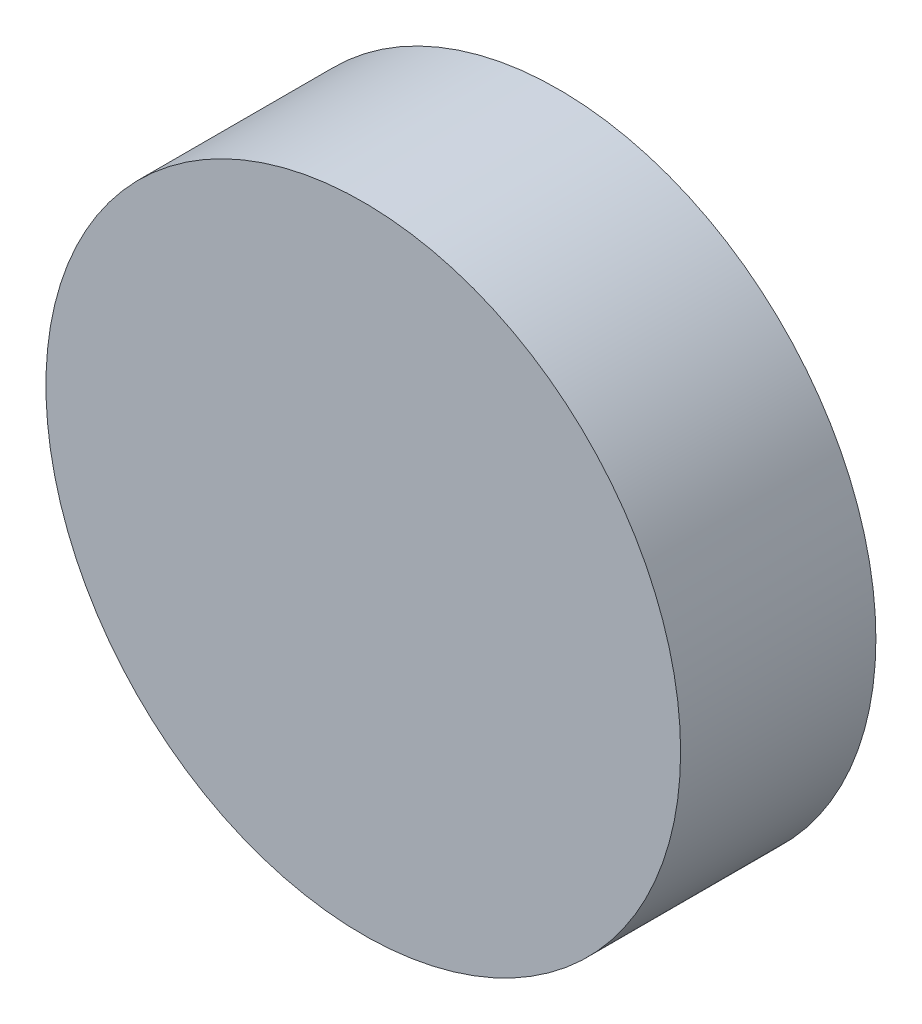
ISO-10303-21;
HEADER;
FILE_DESCRIPTION(('STEP AP214'),'2;1');
FILE_NAME('part.step','',(''),(''),'','','');
FILE_SCHEMA(('AUTOMOTIVE_DESIGN { 1 0 10303 214 1 1 1 1 }'));
ENDSEC;
DATA;
#1=APPLICATION_CONTEXT('core data for automotive mechanical design processes');
#2=APPLICATION_PROTOCOL_DEFINITION('international standard','automotive_design',2000,#1);
#3=PRODUCT_CONTEXT('',#1,'mechanical');
#4=PRODUCT('Part','Part','',(#3));
#5=PRODUCT_RELATED_PRODUCT_CATEGORY('part','',(#4));
#6=PRODUCT_DEFINITION_FORMATION('','',#4);
#7=PRODUCT_DEFINITION_CONTEXT('part definition',#1,'design');
#8=PRODUCT_DEFINITION('design','',#6,#7);
#9=PRODUCT_DEFINITION_SHAPE('','',#8);
#10=(LENGTH_UNIT() NAMED_UNIT(*) SI_UNIT(.MILLI.,.METRE.));
#11=(NAMED_UNIT(*) PLANE_ANGLE_UNIT() SI_UNIT($,.RADIAN.));
#12=(NAMED_UNIT(*) SI_UNIT($,.STERADIAN.) SOLID_ANGLE_UNIT());
#13=UNCERTAINTY_MEASURE_WITH_UNIT(LENGTH_MEASURE(1.E-05),#10,'distance_accuracy_value','');
#14=(GEOMETRIC_REPRESENTATION_CONTEXT(3) GLOBAL_UNCERTAINTY_ASSIGNED_CONTEXT((#13)) GLOBAL_UNIT_ASSIGNED_CONTEXT((#10,
#11,#12)) REPRESENTATION_CONTEXT('',''));
#15=CARTESIAN_POINT('',(0.,0.,0.));
#16=DIRECTION('',(0.,0.,1.));
#17=DIRECTION('',(1.,0.,0.));
#18=AXIS2_PLACEMENT_3D('',#15,#16,#17);
#19=CARTESIAN_POINT('',(0.,0.,20.));
#20=DIRECTION('',(0.,0.,-1.));
#21=DIRECTION('',(-1.,0.,0.));
#22=AXIS2_PLACEMENT_3D('',#19,#20,#21);
#23=CYLINDRICAL_SURFACE('',#22,32.5);
#24=CARTESIAN_POINT('',(0.,0.,20.));
#25=DIRECTION('',(0.,0.,1.));
#26=DIRECTION('',(1.,0.,0.));
#27=AXIS2_PLACEMENT_3D('',#24,#25,#26);
#28=CIRCLE('',#27,32.5);
#29=CARTESIAN_POINT('',(32.5,0.,20.));
#30=VERTEX_POINT('',#29);
#31=EDGE_CURVE('E10',#30,#30,#28,.T.);
#32=ORIENTED_EDGE('',*,*,#31,.F.);
#33=EDGE_LOOP('',(#32));
#34=FACE_BOUND('',#33,.T.);
#35=CARTESIAN_POINT('',(0.,0.,0.));
#36=DIRECTION('',(0.,0.,1.));
#37=DIRECTION('',(1.,0.,0.));
#38=AXIS2_PLACEMENT_3D('',#35,#36,#37);
#39=CIRCLE('',#38,32.5);
#40=CARTESIAN_POINT('',(32.5,0.,0.));
#41=VERTEX_POINT('',#40);
#42=EDGE_CURVE('E40',#41,#41,#39,.T.);
#43=ORIENTED_EDGE('',*,*,#42,.T.);
#44=EDGE_LOOP('',(#43));
#45=FACE_BOUND('',#44,.T.);
#46=ADVANCED_FACE('F37',(#34,#45),#23,.T.);
#47=CARTESIAN_POINT('',(0.,0.,20.));
#48=DIRECTION('',(0.,0.,1.));
#49=DIRECTION('',(1.,0.,0.));
#50=AXIS2_PLACEMENT_3D('',#47,#48,#49);
#51=PLANE('',#50);
#52=ORIENTED_EDGE('',*,*,#31,.T.);
#53=EDGE_LOOP('',(#52));
#54=FACE_BOUND('',#53,.T.);
#55=ADVANCED_FACE('F52',(#54),#51,.T.);
#56=CARTESIAN_POINT('',(0.,0.,0.));
#57=DIRECTION('',(0.,0.,1.));
#58=DIRECTION('',(1.,0.,0.));
#59=AXIS2_PLACEMENT_3D('',#56,#57,#58);
#60=PLANE('',#59);
#61=ORIENTED_EDGE('',*,*,#42,.F.);
#62=EDGE_LOOP('',(#61));
#63=FACE_BOUND('',#62,.T.);
#64=ADVANCED_FACE('F50',(#63),#60,.F.);
#65=CLOSED_SHELL('',(#46,#55,#64));
#66=MANIFOLD_SOLID_BREP('B2',#65);
#67=ADVANCED_BREP_SHAPE_REPRESENTATION('',(#18,#66),#14);
#68=SHAPE_DEFINITION_REPRESENTATION(#9,#67);
ENDSEC;
END-ISO-10303-21;
